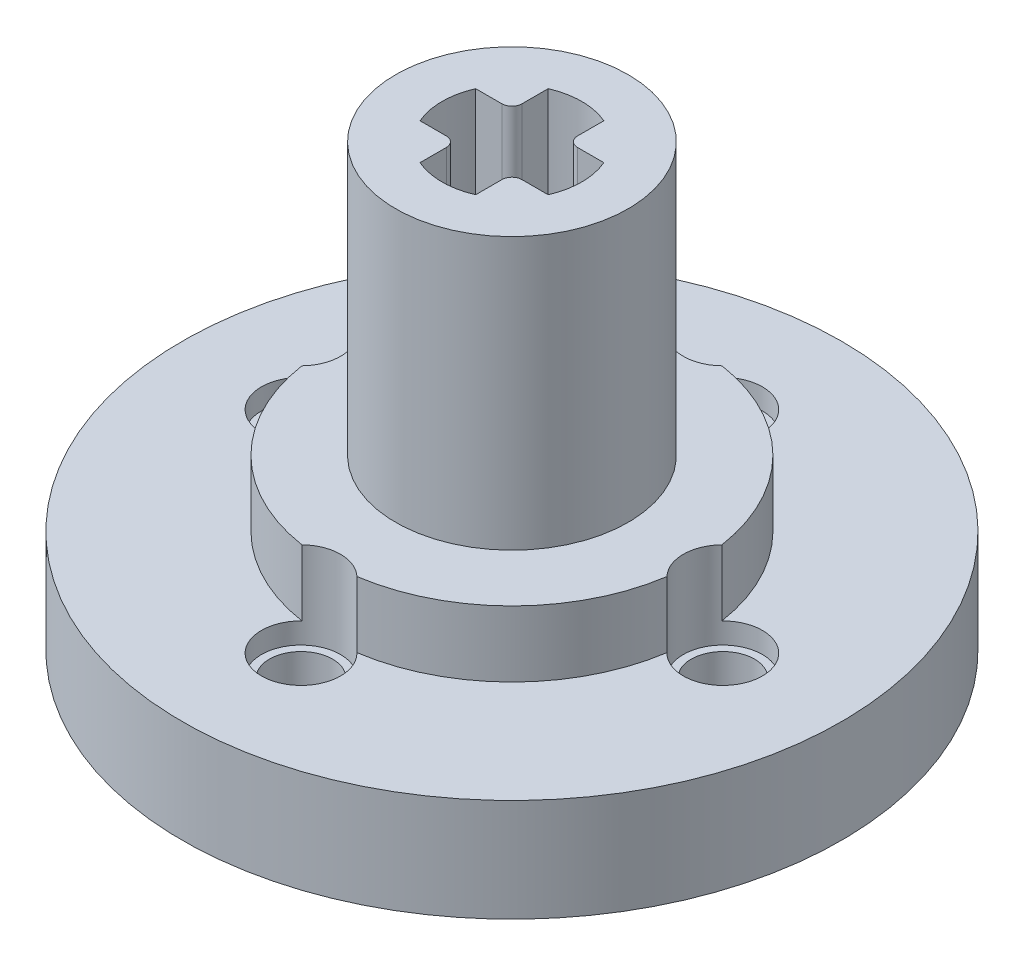
ISO-10303-21;
HEADER;
FILE_DESCRIPTION(('STEP AP214'),'2;1');
FILE_NAME('part.step','',(''),(''),'','','');
FILE_SCHEMA(('AUTOMOTIVE_DESIGN { 1 0 10303 214 1 1 1 1 }'));
ENDSEC;
DATA;
#1=APPLICATION_CONTEXT('core data for automotive mechanical design processes');
#2=APPLICATION_PROTOCOL_DEFINITION('international standard','automotive_design',2000,#1);
#3=PRODUCT_CONTEXT('',#1,'mechanical');
#4=PRODUCT('Part','Part','',(#3));
#5=PRODUCT_RELATED_PRODUCT_CATEGORY('part','',(#4));
#6=PRODUCT_DEFINITION_FORMATION('','',#4);
#7=PRODUCT_DEFINITION_CONTEXT('part definition',#1,'design');
#8=PRODUCT_DEFINITION('design','',#6,#7);
#9=PRODUCT_DEFINITION_SHAPE('','',#8);
#10=(LENGTH_UNIT() NAMED_UNIT(*) SI_UNIT(.MILLI.,.METRE.));
#11=(NAMED_UNIT(*) PLANE_ANGLE_UNIT() SI_UNIT($,.RADIAN.));
#12=(NAMED_UNIT(*) SI_UNIT($,.STERADIAN.) SOLID_ANGLE_UNIT());
#13=UNCERTAINTY_MEASURE_WITH_UNIT(LENGTH_MEASURE(1.E-05),#10,'distance_accuracy_value','');
#14=(GEOMETRIC_REPRESENTATION_CONTEXT(3) GLOBAL_UNCERTAINTY_ASSIGNED_CONTEXT((#13)) GLOBAL_UNIT_ASSIGNED_CONTEXT((#10,
#11,#12)) REPRESENTATION_CONTEXT('',''));
#15=CARTESIAN_POINT('',(0.,0.,0.));
#16=DIRECTION('',(0.,0.,1.));
#17=DIRECTION('',(1.,0.,0.));
#18=AXIS2_PLACEMENT_3D('',#15,#16,#17);
#19=CARTESIAN_POINT('',(0.,0.,0.));
#20=DIRECTION('',(0.,-1.,0.));
#21=DIRECTION('',(0.,0.,-1.));
#22=AXIS2_PLACEMENT_3D('',#19,#20,#21);
#23=CYLINDRICAL_SURFACE('',#22,7.);
#24=CARTESIAN_POINT('',(0.,3.9,0.));
#25=DIRECTION('',(0.,-1.,0.));
#26=DIRECTION('',(0.,0.,-1.));
#27=AXIS2_PLACEMENT_3D('',#24,#25,#26);
#28=CIRCLE('',#27,7.);
#29=CARTESIAN_POINT('',(1.04290291224783,3.9,-6.921875));
#30=VERTEX_POINT('',#29);
#31=CARTESIAN_POINT('',(6.921875,3.9,-1.04290291224782));
#32=VERTEX_POINT('',#31);
#33=EDGE_CURVE('E240',#30,#32,#28,.T.);
#34=ORIENTED_EDGE('',*,*,#33,.F.);
#35=DIRECTION('',(0.,-1.,0.));
#36=VECTOR('',#35,1.);
#37=CARTESIAN_POINT('',(1.04290291224783,4.753125,-6.921875));
#38=LINE('',#37,#36);
#39=CARTESIAN_POINT('',(1.04290291224783,6.4,-6.921875));
#40=VERTEX_POINT('',#39);
#41=EDGE_CURVE('E324',#30,#40,#38,.F.);
#42=ORIENTED_EDGE('',*,*,#41,.T.);
#43=CARTESIAN_POINT('',(0.,6.4,0.));
#44=DIRECTION('',(0.,-1.,0.));
#45=DIRECTION('',(0.,0.,-1.));
#46=AXIS2_PLACEMENT_3D('',#43,#44,#45);
#47=CIRCLE('',#46,7.);
#48=CARTESIAN_POINT('',(6.921875,6.4,-1.04290291224782));
#49=VERTEX_POINT('',#48);
#50=EDGE_CURVE('E230',#40,#49,#47,.T.);
#51=ORIENTED_EDGE('',*,*,#50,.T.);
#52=DIRECTION('',(0.,-1.,0.));
#53=VECTOR('',#52,1.);
#54=CARTESIAN_POINT('',(6.921875,4.753125,-1.04290291224782));
#55=LINE('',#54,#53);
#56=EDGE_CURVE('E207',#49,#32,#55,.T.);
#57=ORIENTED_EDGE('',*,*,#56,.T.);
#58=EDGE_LOOP('',(#34,#42,#51,#57));
#59=FACE_BOUND('',#58,.T.);
#60=ADVANCED_FACE('F41',(#59),#23,.T.);
#61=CARTESIAN_POINT('',(-6.921875,6.4,-1.04290291224782));
#62=VERTEX_POINT('',#61);
#63=CARTESIAN_POINT('',(-1.04290291224783,6.4,-6.921875));
#64=VERTEX_POINT('',#63);
#65=EDGE_CURVE('E234',#62,#64,#47,.T.);
#66=ORIENTED_EDGE('',*,*,#65,.T.);
#67=DIRECTION('',(0.,-1.,0.));
#68=VECTOR('',#67,1.);
#69=CARTESIAN_POINT('',(-1.04290291224783,4.753125,-6.921875));
#70=LINE('',#69,#68);
#71=CARTESIAN_POINT('',(-1.04290291224783,3.9,-6.921875));
#72=VERTEX_POINT('',#71);
#73=EDGE_CURVE('E56',#64,#72,#70,.T.);
#74=ORIENTED_EDGE('',*,*,#73,.T.);
#75=CARTESIAN_POINT('',(-6.921875,3.9,-1.04290291224782));
#76=VERTEX_POINT('',#75);
#77=EDGE_CURVE('E233',#76,#72,#28,.T.);
#78=ORIENTED_EDGE('',*,*,#77,.F.);
#79=DIRECTION('',(0.,-1.,0.));
#80=VECTOR('',#79,1.);
#81=CARTESIAN_POINT('',(-6.921875,4.753125,-1.04290291224782));
#82=LINE('',#81,#80);
#83=EDGE_CURVE('E318',#76,#62,#82,.F.);
#84=ORIENTED_EDGE('',*,*,#83,.T.);
#85=EDGE_LOOP('',(#66,#74,#78,#84));
#86=FACE_BOUND('',#85,.T.);
#87=ADVANCED_FACE('F265',(#86),#23,.T.);
#88=CARTESIAN_POINT('',(-1.04290291224783,6.4,6.921875));
#89=VERTEX_POINT('',#88);
#90=CARTESIAN_POINT('',(-6.921875,6.4,1.04290291224782));
#91=VERTEX_POINT('',#90);
#92=EDGE_CURVE('E231',#89,#91,#47,.T.);
#93=ORIENTED_EDGE('',*,*,#92,.T.);
#94=DIRECTION('',(0.,-1.,0.));
#95=VECTOR('',#94,1.);
#96=CARTESIAN_POINT('',(-6.921875,4.753125,1.04290291224783));
#97=LINE('',#96,#95);
#98=CARTESIAN_POINT('',(-6.921875,3.9,1.04290291224783));
#99=VERTEX_POINT('',#98);
#100=EDGE_CURVE('E63',#91,#99,#97,.T.);
#101=ORIENTED_EDGE('',*,*,#100,.T.);
#102=CARTESIAN_POINT('',(-1.04290291224783,3.9,6.921875));
#103=VERTEX_POINT('',#102);
#104=EDGE_CURVE('E461',#103,#99,#28,.T.);
#105=ORIENTED_EDGE('',*,*,#104,.F.);
#106=DIRECTION('',(0.,-1.,0.));
#107=VECTOR('',#106,1.);
#108=CARTESIAN_POINT('',(-1.04290291224783,4.753125,6.921875));
#109=LINE('',#108,#107);
#110=EDGE_CURVE('E288',#103,#89,#109,.F.);
#111=ORIENTED_EDGE('',*,*,#110,.T.);
#112=EDGE_LOOP('',(#93,#101,#105,#111));
#113=FACE_BOUND('',#112,.T.);
#114=ADVANCED_FACE('F272',(#113),#23,.T.);
#115=CARTESIAN_POINT('',(6.921875,6.4,1.04290291224783));
#116=VERTEX_POINT('',#115);
#117=CARTESIAN_POINT('',(1.04290291224783,6.4,6.921875));
#118=VERTEX_POINT('',#117);
#119=EDGE_CURVE('E220',#116,#118,#47,.T.);
#120=ORIENTED_EDGE('',*,*,#119,.T.);
#121=DIRECTION('',(0.,-1.,0.));
#122=VECTOR('',#121,1.);
#123=CARTESIAN_POINT('',(1.04290291224783,4.753125,6.921875));
#124=LINE('',#123,#122);
#125=CARTESIAN_POINT('',(1.04290291224783,3.9,6.921875));
#126=VERTEX_POINT('',#125);
#127=EDGE_CURVE('E223',#118,#126,#124,.T.);
#128=ORIENTED_EDGE('',*,*,#127,.T.);
#129=CARTESIAN_POINT('',(6.921875,3.9,1.04290291224782));
#130=VERTEX_POINT('',#129);
#131=EDGE_CURVE('E222',#130,#126,#28,.T.);
#132=ORIENTED_EDGE('',*,*,#131,.F.);
#133=DIRECTION('',(0.,-1.,0.));
#134=VECTOR('',#133,1.);
#135=CARTESIAN_POINT('',(6.921875,4.753125,1.04290291224783));
#136=LINE('',#135,#134);
#137=EDGE_CURVE('E204',#130,#116,#136,.F.);
#138=ORIENTED_EDGE('',*,*,#137,.T.);
#139=EDGE_LOOP('',(#120,#128,#132,#138));
#140=FACE_BOUND('',#139,.T.);
#141=ADVANCED_FACE('F218',(#140),#23,.T.);
#142=CARTESIAN_POINT('',(0.,0.,0.));
#143=DIRECTION('',(0.,-1.,0.));
#144=DIRECTION('',(0.,0.,-1.));
#145=AXIS2_PLACEMENT_3D('',#142,#143,#144);
#146=PLANE('',#145);
#147=CARTESIAN_POINT('',(8.,0.,0.));
#148=DIRECTION('',(0.,-1.,0.));
#149=DIRECTION('',(0.,0.,-1.));
#150=AXIS2_PLACEMENT_3D('',#147,#148,#149);
#151=CIRCLE('',#150,1.2);
#152=CARTESIAN_POINT('',(8.,0.,-1.2));
#153=VERTEX_POINT('',#152);
#154=EDGE_CURVE('E661',#153,#153,#151,.F.);
#155=ORIENTED_EDGE('',*,*,#154,.T.);
#156=EDGE_LOOP('',(#155));
#157=FACE_BOUND('',#156,.T.);
#158=CARTESIAN_POINT('',(0.,0.,-8.));
#159=DIRECTION('',(0.,-1.,0.));
#160=DIRECTION('',(0.,0.,-1.));
#161=AXIS2_PLACEMENT_3D('',#158,#159,#160);
#162=CIRCLE('',#161,1.2);
#163=CARTESIAN_POINT('',(0.,0.,-9.2));
#164=VERTEX_POINT('',#163);
#165=EDGE_CURVE('E668',#164,#164,#162,.F.);
#166=ORIENTED_EDGE('',*,*,#165,.T.);
#167=EDGE_LOOP('',(#166));
#168=FACE_BOUND('',#167,.T.);
#169=CARTESIAN_POINT('',(-8.,0.,0.));
#170=DIRECTION('',(0.,-1.,0.));
#171=DIRECTION('',(0.,0.,-1.));
#172=AXIS2_PLACEMENT_3D('',#169,#170,#171);
#173=CIRCLE('',#172,1.2);
#174=CARTESIAN_POINT('',(-8.,0.,-1.2));
#175=VERTEX_POINT('',#174);
#176=EDGE_CURVE('E673',#175,#175,#173,.F.);
#177=ORIENTED_EDGE('',*,*,#176,.T.);
#178=EDGE_LOOP('',(#177));
#179=FACE_BOUND('',#178,.T.);
#180=CARTESIAN_POINT('',(0.,0.,8.));
#181=DIRECTION('',(0.,-1.,0.));
#182=DIRECTION('',(0.,0.,-1.));
#183=AXIS2_PLACEMENT_3D('',#180,#181,#182);
#184=CIRCLE('',#183,1.2);
#185=CARTESIAN_POINT('',(0.,0.,6.8));
#186=VERTEX_POINT('',#185);
#187=EDGE_CURVE('E676',#186,#186,#184,.F.);
#188=ORIENTED_EDGE('',*,*,#187,.T.);
#189=EDGE_LOOP('',(#188));
#190=FACE_BOUND('',#189,.T.);
#191=CARTESIAN_POINT('',(0.,0.,0.));
#192=DIRECTION('',(0.,-1.,0.));
#193=DIRECTION('',(0.,0.,-1.));
#194=AXIS2_PLACEMENT_3D('',#191,#192,#193);
#195=CIRCLE('',#194,12.5);
#196=CARTESIAN_POINT('',(0.,0.,-12.5));
#197=VERTEX_POINT('',#196);
#198=EDGE_CURVE('E49',#197,#197,#195,.T.);
#199=ORIENTED_EDGE('',*,*,#198,.T.);
#200=EDGE_LOOP('',(#199));
#201=FACE_BOUND('',#200,.T.);
#202=DIRECTION('',(1.,0.,0.));
#203=VECTOR('',#202,1.);
#204=CARTESIAN_POINT('',(0.,0.,1.055));
#205=LINE('',#204,#203);
#206=CARTESIAN_POINT('',(-2.43004155190476,0.,1.055));
#207=VERTEX_POINT('',#206);
#208=CARTESIAN_POINT('',(-1.435,0.,1.055));
#209=VERTEX_POINT('',#208);
#210=EDGE_CURVE('E364',#207,#209,#205,.T.);
#211=ORIENTED_EDGE('',*,*,#210,.T.);
#212=CARTESIAN_POINT('',(-1.435,0.,1.435));
#213=DIRECTION('',(0.,-1.,0.));
#214=DIRECTION('',(0.,0.,-1.));
#215=AXIS2_PLACEMENT_3D('',#212,#213,#214);
#216=CIRCLE('',#215,0.38);
#217=CARTESIAN_POINT('',(-1.055,0.,1.435));
#218=VERTEX_POINT('',#217);
#219=EDGE_CURVE('E417',#209,#218,#216,.T.);
#220=ORIENTED_EDGE('',*,*,#219,.T.);
#221=DIRECTION('',(0.,0.,1.));
#222=VECTOR('',#221,1.);
#223=CARTESIAN_POINT('',(-1.055,0.,0.));
#224=LINE('',#223,#222);
#225=CARTESIAN_POINT('',(-1.055,0.,2.43004155190476));
#226=VERTEX_POINT('',#225);
#227=EDGE_CURVE('E327',#218,#226,#224,.T.);
#228=ORIENTED_EDGE('',*,*,#227,.T.);
#229=CARTESIAN_POINT('',(0.,0.,0.));
#230=DIRECTION('',(0.,-1.,0.));
#231=DIRECTION('',(0.,0.,-1.));
#232=AXIS2_PLACEMENT_3D('',#229,#230,#231);
#233=CIRCLE('',#232,2.64917476659878);
#234=CARTESIAN_POINT('',(1.055,0.,2.43004155190476));
#235=VERTEX_POINT('',#234);
#236=EDGE_CURVE('E330',#226,#235,#233,.F.);
#237=ORIENTED_EDGE('',*,*,#236,.T.);
#238=DIRECTION('',(0.,0.,1.));
#239=VECTOR('',#238,1.);
#240=CARTESIAN_POINT('',(1.055,0.,0.));
#241=LINE('',#240,#239);
#242=CARTESIAN_POINT('',(1.055,0.,1.435));
#243=VERTEX_POINT('',#242);
#244=EDGE_CURVE('E333',#243,#235,#241,.T.);
#245=ORIENTED_EDGE('',*,*,#244,.F.);
#246=CARTESIAN_POINT('',(1.435,0.,1.435));
#247=DIRECTION('',(0.,-1.,0.));
#248=DIRECTION('',(0.,0.,-1.));
#249=AXIS2_PLACEMENT_3D('',#246,#247,#248);
#250=CIRCLE('',#249,0.38);
#251=CARTESIAN_POINT('',(1.435,0.,1.055));
#252=VERTEX_POINT('',#251);
#253=EDGE_CURVE('E335',#243,#252,#250,.T.);
#254=ORIENTED_EDGE('',*,*,#253,.T.);
#255=DIRECTION('',(1.,0.,0.));
#256=VECTOR('',#255,1.);
#257=CARTESIAN_POINT('',(0.,0.,1.055));
#258=LINE('',#257,#256);
#259=CARTESIAN_POINT('',(2.43004155190476,0.,1.055));
#260=VERTEX_POINT('',#259);
#261=EDGE_CURVE('E338',#252,#260,#258,.T.);
#262=ORIENTED_EDGE('',*,*,#261,.T.);
#263=CARTESIAN_POINT('',(0.,0.,0.));
#264=DIRECTION('',(0.,-1.,0.));
#265=DIRECTION('',(0.,0.,-1.));
#266=AXIS2_PLACEMENT_3D('',#263,#264,#265);
#267=CIRCLE('',#266,2.64917476659878);
#268=CARTESIAN_POINT('',(2.43004155190476,0.,-1.055));
#269=VERTEX_POINT('',#268);
#270=EDGE_CURVE('E341',#260,#269,#267,.F.);
#271=ORIENTED_EDGE('',*,*,#270,.T.);
#272=DIRECTION('',(1.,0.,0.));
#273=VECTOR('',#272,1.);
#274=CARTESIAN_POINT('',(0.,0.,-1.055));
#275=LINE('',#274,#273);
#276=CARTESIAN_POINT('',(1.435,0.,-1.055));
#277=VERTEX_POINT('',#276);
#278=EDGE_CURVE('E344',#277,#269,#275,.T.);
#279=ORIENTED_EDGE('',*,*,#278,.F.);
#280=CARTESIAN_POINT('',(1.435,0.,-1.435));
#281=DIRECTION('',(0.,-1.,0.));
#282=DIRECTION('',(0.,0.,-1.));
#283=AXIS2_PLACEMENT_3D('',#280,#281,#282);
#284=CIRCLE('',#283,0.38);
#285=CARTESIAN_POINT('',(1.055,0.,-1.435));
#286=VERTEX_POINT('',#285);
#287=EDGE_CURVE('E346',#286,#277,#284,.F.);
#288=ORIENTED_EDGE('',*,*,#287,.F.);
#289=DIRECTION('',(0.,0.,1.));
#290=VECTOR('',#289,1.);
#291=CARTESIAN_POINT('',(1.055,0.,0.));
#292=LINE('',#291,#290);
#293=CARTESIAN_POINT('',(1.055,0.,-2.43004155190476));
#294=VERTEX_POINT('',#293);
#295=EDGE_CURVE('E348',#294,#286,#292,.T.);
#296=ORIENTED_EDGE('',*,*,#295,.F.);
#297=CARTESIAN_POINT('',(0.,0.,0.));
#298=DIRECTION('',(0.,-1.,0.));
#299=DIRECTION('',(0.,0.,-1.));
#300=AXIS2_PLACEMENT_3D('',#297,#298,#299);
#301=CIRCLE('',#300,2.64917476659878);
#302=CARTESIAN_POINT('',(-1.055,0.,-2.43004155190476));
#303=VERTEX_POINT('',#302);
#304=EDGE_CURVE('E350',#294,#303,#301,.F.);
#305=ORIENTED_EDGE('',*,*,#304,.T.);
#306=DIRECTION('',(0.,0.,1.));
#307=VECTOR('',#306,1.);
#308=CARTESIAN_POINT('',(-1.055,0.,0.));
#309=LINE('',#308,#307);
#310=CARTESIAN_POINT('',(-1.055,0.,-1.435));
#311=VERTEX_POINT('',#310);
#312=EDGE_CURVE('E353',#303,#311,#309,.T.);
#313=ORIENTED_EDGE('',*,*,#312,.T.);
#314=CARTESIAN_POINT('',(-1.435,0.,-1.435));
#315=DIRECTION('',(0.,-1.,0.));
#316=DIRECTION('',(0.,0.,-1.));
#317=AXIS2_PLACEMENT_3D('',#314,#315,#316);
#318=CIRCLE('',#317,0.38);
#319=CARTESIAN_POINT('',(-1.435,0.,-1.055));
#320=VERTEX_POINT('',#319);
#321=EDGE_CURVE('E356',#311,#320,#318,.T.);
#322=ORIENTED_EDGE('',*,*,#321,.T.);
#323=DIRECTION('',(1.,0.,0.));
#324=VECTOR('',#323,1.);
#325=CARTESIAN_POINT('',(0.,0.,-1.055));
#326=LINE('',#325,#324);
#327=CARTESIAN_POINT('',(-2.43004155190476,0.,-1.055));
#328=VERTEX_POINT('',#327);
#329=EDGE_CURVE('E359',#328,#320,#326,.T.);
#330=ORIENTED_EDGE('',*,*,#329,.F.);
#331=CARTESIAN_POINT('',(0.,0.,0.));
#332=DIRECTION('',(0.,-1.,0.));
#333=DIRECTION('',(0.,0.,-1.));
#334=AXIS2_PLACEMENT_3D('',#331,#332,#333);
#335=CIRCLE('',#334,2.64917476659878);
#336=EDGE_CURVE('E361',#328,#207,#335,.F.);
#337=ORIENTED_EDGE('',*,*,#336,.T.);
#338=EDGE_LOOP('',(#211,#220,#228,#237,#245,#254,#262,#271,#279,#288,#296,#305,#313,#322,#330,#337));
#339=FACE_BOUND('',#338,.T.);
#340=ADVANCED_FACE('F43',(#157,#168,#179,#190,#201,#339),#146,.T.);
#341=CARTESIAN_POINT('',(4.41,16.7,0.));
#342=DIRECTION('',(0.,1.,0.));
#343=DIRECTION('',(0.,0.,1.));
#344=AXIS2_PLACEMENT_3D('',#341,#342,#343);
#345=PLANE('',#344);
#346=CARTESIAN_POINT('',(0.,16.7,0.));
#347=DIRECTION('',(0.,-1.,0.));
#348=DIRECTION('',(0.,0.,-1.));
#349=AXIS2_PLACEMENT_3D('',#346,#347,#348);
#350=CIRCLE('',#349,4.41);
#351=CARTESIAN_POINT('',(0.,16.7,-4.41));
#352=VERTEX_POINT('',#351);
#353=EDGE_CURVE('E449',#352,#352,#350,.T.);
#354=ORIENTED_EDGE('',*,*,#353,.F.);
#355=EDGE_LOOP('',(#354));
#356=FACE_BOUND('',#355,.T.);
#357=DIRECTION('',(1.,0.,0.));
#358=VECTOR('',#357,1.);
#359=CARTESIAN_POINT('',(0.,16.7,1.055));
#360=LINE('',#359,#358);
#361=CARTESIAN_POINT('',(-2.43004155190476,16.7,1.055));
#362=VERTEX_POINT('',#361);
#363=CARTESIAN_POINT('',(-1.435,16.7,1.055));
#364=VERTEX_POINT('',#363);
#365=EDGE_CURVE('E367',#362,#364,#360,.T.);
#366=ORIENTED_EDGE('',*,*,#365,.F.);
#367=CARTESIAN_POINT('',(0.,16.7,0.));
#368=DIRECTION('',(0.,1.,0.));
#369=DIRECTION('',(0.,0.,1.));
#370=AXIS2_PLACEMENT_3D('',#367,#368,#369);
#371=CIRCLE('',#370,2.64917476659878);
#372=CARTESIAN_POINT('',(-2.43004155190476,16.7,-1.055));
#373=VERTEX_POINT('',#372);
#374=EDGE_CURVE('E411',#373,#362,#371,.T.);
#375=ORIENTED_EDGE('',*,*,#374,.F.);
#376=DIRECTION('',(1.,0.,0.));
#377=VECTOR('',#376,1.);
#378=CARTESIAN_POINT('',(0.,16.7,-1.055));
#379=LINE('',#378,#377);
#380=CARTESIAN_POINT('',(-1.435,16.7,-1.055));
#381=VERTEX_POINT('',#380);
#382=EDGE_CURVE('E408',#373,#381,#379,.T.);
#383=ORIENTED_EDGE('',*,*,#382,.T.);
#384=CARTESIAN_POINT('',(-1.435,16.7,-1.435));
#385=DIRECTION('',(0.,1.,0.));
#386=DIRECTION('',(0.,0.,1.));
#387=AXIS2_PLACEMENT_3D('',#384,#385,#386);
#388=CIRCLE('',#387,0.38);
#389=CARTESIAN_POINT('',(-1.055,16.7,-1.435));
#390=VERTEX_POINT('',#389);
#391=EDGE_CURVE('E405',#390,#381,#388,.F.);
#392=ORIENTED_EDGE('',*,*,#391,.F.);
#393=DIRECTION('',(0.,0.,1.));
#394=VECTOR('',#393,1.);
#395=CARTESIAN_POINT('',(-1.055,16.7,0.));
#396=LINE('',#395,#394);
#397=CARTESIAN_POINT('',(-1.055,16.7,-2.43004155190476));
#398=VERTEX_POINT('',#397);
#399=EDGE_CURVE('E402',#398,#390,#396,.T.);
#400=ORIENTED_EDGE('',*,*,#399,.F.);
#401=CARTESIAN_POINT('',(0.,16.7,0.));
#402=DIRECTION('',(0.,1.,0.));
#403=DIRECTION('',(0.,0.,1.));
#404=AXIS2_PLACEMENT_3D('',#401,#402,#403);
#405=CIRCLE('',#404,2.64917476659878);
#406=CARTESIAN_POINT('',(1.055,16.7,-2.43004155190476));
#407=VERTEX_POINT('',#406);
#408=EDGE_CURVE('E399',#407,#398,#405,.T.);
#409=ORIENTED_EDGE('',*,*,#408,.F.);
#410=DIRECTION('',(0.,0.,1.));
#411=VECTOR('',#410,1.);
#412=CARTESIAN_POINT('',(1.055,16.7,0.));
#413=LINE('',#412,#411);
#414=CARTESIAN_POINT('',(1.055,16.7,-1.435));
#415=VERTEX_POINT('',#414);
#416=EDGE_CURVE('E396',#407,#415,#413,.T.);
#417=ORIENTED_EDGE('',*,*,#416,.T.);
#418=CARTESIAN_POINT('',(1.435,16.7,-1.435));
#419=DIRECTION('',(0.,1.,0.));
#420=DIRECTION('',(0.,0.,1.));
#421=AXIS2_PLACEMENT_3D('',#418,#419,#420);
#422=CIRCLE('',#421,0.38);
#423=CARTESIAN_POINT('',(1.435,16.7,-1.055));
#424=VERTEX_POINT('',#423);
#425=EDGE_CURVE('E393',#415,#424,#422,.T.);
#426=ORIENTED_EDGE('',*,*,#425,.T.);
#427=DIRECTION('',(1.,0.,0.));
#428=VECTOR('',#427,1.);
#429=CARTESIAN_POINT('',(0.,16.7,-1.055));
#430=LINE('',#429,#428);
#431=CARTESIAN_POINT('',(2.43004155190476,16.7,-1.055));
#432=VERTEX_POINT('',#431);
#433=EDGE_CURVE('E390',#424,#432,#430,.T.);
#434=ORIENTED_EDGE('',*,*,#433,.T.);
#435=CARTESIAN_POINT('',(0.,16.7,0.));
#436=DIRECTION('',(0.,1.,0.));
#437=DIRECTION('',(0.,0.,1.));
#438=AXIS2_PLACEMENT_3D('',#435,#436,#437);
#439=CIRCLE('',#438,2.64917476659878);
#440=CARTESIAN_POINT('',(2.43004155190476,16.7,1.055));
#441=VERTEX_POINT('',#440);
#442=EDGE_CURVE('E387',#441,#432,#439,.T.);
#443=ORIENTED_EDGE('',*,*,#442,.F.);
#444=DIRECTION('',(1.,0.,0.));
#445=VECTOR('',#444,1.);
#446=CARTESIAN_POINT('',(0.,16.7,1.055));
#447=LINE('',#446,#445);
#448=CARTESIAN_POINT('',(1.435,16.7,1.055));
#449=VERTEX_POINT('',#448);
#450=EDGE_CURVE('E384',#449,#441,#447,.T.);
#451=ORIENTED_EDGE('',*,*,#450,.F.);
#452=CARTESIAN_POINT('',(1.435,16.7,1.435));
#453=DIRECTION('',(0.,1.,0.));
#454=DIRECTION('',(0.,0.,1.));
#455=AXIS2_PLACEMENT_3D('',#452,#453,#454);
#456=CIRCLE('',#455,0.38);
#457=CARTESIAN_POINT('',(1.055,16.7,1.435));
#458=VERTEX_POINT('',#457);
#459=EDGE_CURVE('E381',#458,#449,#456,.F.);
#460=ORIENTED_EDGE('',*,*,#459,.F.);
#461=DIRECTION('',(0.,0.,1.));
#462=VECTOR('',#461,1.);
#463=CARTESIAN_POINT('',(1.055,16.7,0.));
#464=LINE('',#463,#462);
#465=CARTESIAN_POINT('',(1.055,16.7,2.43004155190476));
#466=VERTEX_POINT('',#465);
#467=EDGE_CURVE('E378',#458,#466,#464,.T.);
#468=ORIENTED_EDGE('',*,*,#467,.T.);
#469=CARTESIAN_POINT('',(0.,16.7,0.));
#470=DIRECTION('',(0.,1.,0.));
#471=DIRECTION('',(0.,0.,1.));
#472=AXIS2_PLACEMENT_3D('',#469,#470,#471);
#473=CIRCLE('',#472,2.64917476659878);
#474=CARTESIAN_POINT('',(-1.055,16.7,2.43004155190476));
#475=VERTEX_POINT('',#474);
#476=EDGE_CURVE('E375',#475,#466,#473,.T.);
#477=ORIENTED_EDGE('',*,*,#476,.F.);
#478=DIRECTION('',(0.,0.,1.));
#479=VECTOR('',#478,1.);
#480=CARTESIAN_POINT('',(-1.055,16.7,0.));
#481=LINE('',#480,#479);
#482=CARTESIAN_POINT('',(-1.055,16.7,1.435));
#483=VERTEX_POINT('',#482);
#484=EDGE_CURVE('E372',#483,#475,#481,.T.);
#485=ORIENTED_EDGE('',*,*,#484,.F.);
#486=CARTESIAN_POINT('',(-1.435,16.7,1.435));
#487=DIRECTION('',(0.,1.,0.));
#488=DIRECTION('',(0.,0.,1.));
#489=AXIS2_PLACEMENT_3D('',#486,#487,#488);
#490=CIRCLE('',#489,0.38);
#491=EDGE_CURVE('E369',#364,#483,#490,.F.);
#492=ORIENTED_EDGE('',*,*,#491,.F.);
#493=EDGE_LOOP('',(#366,#375,#383,#392,#400,#409,#417,#426,#434,#443,#451,#460,#468,#477,#485,#492));
#494=FACE_BOUND('',#493,.T.);
#495=ADVANCED_FACE('F253',(#356,#494),#345,.T.);
#496=CARTESIAN_POINT('',(0.,0.,0.));
#497=DIRECTION('',(0.,-1.,0.));
#498=DIRECTION('',(0.,0.,-1.));
#499=AXIS2_PLACEMENT_3D('',#496,#497,#498);
#500=CYLINDRICAL_SURFACE('',#499,12.5);
#501=CARTESIAN_POINT('',(0.,3.9,0.));
#502=DIRECTION('',(0.,-1.,0.));
#503=DIRECTION('',(0.,0.,-1.));
#504=AXIS2_PLACEMENT_3D('',#501,#502,#503);
#505=CIRCLE('',#504,12.5);
#506=CARTESIAN_POINT('',(0.,3.9,-12.5));
#507=VERTEX_POINT('',#506);
#508=EDGE_CURVE('E243',#507,#507,#505,.T.);
#509=ORIENTED_EDGE('',*,*,#508,.T.);
#510=EDGE_LOOP('',(#509));
#511=FACE_BOUND('',#510,.T.);
#512=ORIENTED_EDGE('',*,*,#198,.F.);
#513=EDGE_LOOP('',(#512));
#514=FACE_BOUND('',#513,.T.);
#515=ADVANCED_FACE('F250',(#511,#514),#500,.T.);
#516=CARTESIAN_POINT('',(12.5,3.9,0.));
#517=DIRECTION('',(0.,1.,0.));
#518=DIRECTION('',(0.,0.,1.));
#519=AXIS2_PLACEMENT_3D('',#516,#517,#518);
#520=PLANE('',#519);
#521=ORIENTED_EDGE('',*,*,#77,.T.);
#522=CARTESIAN_POINT('',(0.,3.9,-8.));
#523=DIRECTION('',(0.,1.,0.));
#524=DIRECTION('',(0.,0.,1.));
#525=AXIS2_PLACEMENT_3D('',#522,#523,#524);
#526=CIRCLE('',#525,1.5);
#527=EDGE_CURVE('E321',#72,#30,#526,.F.);
#528=ORIENTED_EDGE('',*,*,#527,.T.);
#529=ORIENTED_EDGE('',*,*,#33,.T.);
#530=CARTESIAN_POINT('',(8.,3.9,0.));
#531=DIRECTION('',(0.,1.,0.));
#532=DIRECTION('',(0.,0.,1.));
#533=AXIS2_PLACEMENT_3D('',#530,#531,#532);
#534=CIRCLE('',#533,1.5);
#535=EDGE_CURVE('E224',#32,#130,#534,.F.);
#536=ORIENTED_EDGE('',*,*,#535,.T.);
#537=ORIENTED_EDGE('',*,*,#131,.T.);
#538=CARTESIAN_POINT('',(0.,3.9,8.));
#539=DIRECTION('',(0.,1.,0.));
#540=DIRECTION('',(0.,0.,1.));
#541=AXIS2_PLACEMENT_3D('',#538,#539,#540);
#542=CIRCLE('',#541,1.5);
#543=EDGE_CURVE('E310',#126,#103,#542,.F.);
#544=ORIENTED_EDGE('',*,*,#543,.T.);
#545=ORIENTED_EDGE('',*,*,#104,.T.);
#546=CARTESIAN_POINT('',(-8.,3.9,0.));
#547=DIRECTION('',(0.,1.,0.));
#548=DIRECTION('',(0.,0.,1.));
#549=AXIS2_PLACEMENT_3D('',#546,#547,#548);
#550=CIRCLE('',#549,1.5);
#551=EDGE_CURVE('E315',#99,#76,#550,.F.);
#552=ORIENTED_EDGE('',*,*,#551,.T.);
#553=EDGE_LOOP('',(#521,#528,#529,#536,#537,#544,#545,#552));
#554=FACE_BOUND('',#553,.T.);
#555=ORIENTED_EDGE('',*,*,#508,.F.);
#556=EDGE_LOOP('',(#555));
#557=FACE_BOUND('',#556,.T.);
#558=ADVANCED_FACE('F252',(#554,#557),#520,.T.);
#559=CARTESIAN_POINT('',(7.,6.4,0.));
#560=DIRECTION('',(0.,1.,0.));
#561=DIRECTION('',(0.,0.,1.));
#562=AXIS2_PLACEMENT_3D('',#559,#560,#561);
#563=PLANE('',#562);
#564=CARTESIAN_POINT('',(0.,6.4,0.));
#565=DIRECTION('',(0.,-1.,0.));
#566=DIRECTION('',(0.,0.,-1.));
#567=AXIS2_PLACEMENT_3D('',#564,#565,#566);
#568=CIRCLE('',#567,4.41);
#569=CARTESIAN_POINT('',(0.,6.4,-4.41));
#570=VERTEX_POINT('',#569);
#571=EDGE_CURVE('E238',#570,#570,#568,.T.);
#572=ORIENTED_EDGE('',*,*,#571,.T.);
#573=EDGE_LOOP('',(#572));
#574=FACE_BOUND('',#573,.T.);
#575=ORIENTED_EDGE('',*,*,#50,.F.);
#576=CARTESIAN_POINT('',(0.,6.4,-8.));
#577=DIRECTION('',(0.,1.,0.));
#578=DIRECTION('',(0.,0.,1.));
#579=AXIS2_PLACEMENT_3D('',#576,#577,#578);
#580=CIRCLE('',#579,1.5);
#581=EDGE_CURVE('E11',#40,#64,#580,.F.);
#582=ORIENTED_EDGE('',*,*,#581,.T.);
#583=ORIENTED_EDGE('',*,*,#65,.F.);
#584=CARTESIAN_POINT('',(-8.,6.4,0.));
#585=DIRECTION('',(0.,1.,0.));
#586=DIRECTION('',(0.,0.,1.));
#587=AXIS2_PLACEMENT_3D('',#584,#585,#586);
#588=CIRCLE('',#587,1.5);
#589=EDGE_CURVE('E290',#91,#62,#588,.T.);
#590=ORIENTED_EDGE('',*,*,#589,.F.);
#591=ORIENTED_EDGE('',*,*,#92,.F.);
#592=CARTESIAN_POINT('',(0.,6.4,8.));
#593=DIRECTION('',(0.,1.,0.));
#594=DIRECTION('',(0.,0.,1.));
#595=AXIS2_PLACEMENT_3D('',#592,#593,#594);
#596=CIRCLE('',#595,1.5);
#597=EDGE_CURVE('E229',#118,#89,#596,.T.);
#598=ORIENTED_EDGE('',*,*,#597,.F.);
#599=ORIENTED_EDGE('',*,*,#119,.F.);
#600=CARTESIAN_POINT('',(8.,6.4,0.));
#601=DIRECTION('',(0.,1.,0.));
#602=DIRECTION('',(0.,0.,1.));
#603=AXIS2_PLACEMENT_3D('',#600,#601,#602);
#604=CIRCLE('',#603,1.5);
#605=EDGE_CURVE('E200',#49,#116,#604,.T.);
#606=ORIENTED_EDGE('',*,*,#605,.F.);
#607=EDGE_LOOP('',(#575,#582,#583,#590,#591,#598,#599,#606));
#608=FACE_BOUND('',#607,.T.);
#609=ADVANCED_FACE('F227',(#574,#608),#563,.T.);
#610=CARTESIAN_POINT('',(0.,0.,0.));
#611=DIRECTION('',(0.,-1.,0.));
#612=DIRECTION('',(0.,0.,-1.));
#613=AXIS2_PLACEMENT_3D('',#610,#611,#612);
#614=CYLINDRICAL_SURFACE('',#613,4.41);
#615=ORIENTED_EDGE('',*,*,#353,.T.);
#616=EDGE_LOOP('',(#615));
#617=FACE_BOUND('',#616,.T.);
#618=ORIENTED_EDGE('',*,*,#571,.F.);
#619=EDGE_LOOP('',(#618));
#620=FACE_BOUND('',#619,.T.);
#621=ADVANCED_FACE('F564',(#617,#620),#614,.T.);
#622=CARTESIAN_POINT('',(0.,-0.001000000000001,1.055));
#623=DIRECTION('',(0.,0.,1.));
#624=DIRECTION('',(1.,0.,0.));
#625=AXIS2_PLACEMENT_3D('',#622,#623,#624);
#626=PLANE('',#625);
#627=DIRECTION('',(0.,1.,0.));
#628=VECTOR('',#627,1.);
#629=CARTESIAN_POINT('',(-2.43004155190476,-0.001000000000001,1.055));
#630=LINE('',#629,#628);
#631=EDGE_CURVE('E415',#207,#362,#630,.T.);
#632=ORIENTED_EDGE('',*,*,#631,.T.);
#633=ORIENTED_EDGE('',*,*,#365,.T.);
#634=DIRECTION('',(0.,1.,0.));
#635=VECTOR('',#634,1.);
#636=CARTESIAN_POINT('',(-1.435,-0.001000000000001,1.055));
#637=LINE('',#636,#635);
#638=EDGE_CURVE('E414',#209,#364,#637,.T.);
#639=ORIENTED_EDGE('',*,*,#638,.F.);
#640=ORIENTED_EDGE('',*,*,#210,.F.);
#641=EDGE_LOOP('',(#632,#633,#639,#640));
#642=FACE_BOUND('',#641,.T.);
#643=ADVANCED_FACE('F508',(#642),#626,.F.);
#644=CARTESIAN_POINT('',(0.,-0.001000000000001,0.));
#645=DIRECTION('',(0.,1.,0.));
#646=DIRECTION('',(0.,0.,1.));
#647=AXIS2_PLACEMENT_3D('',#644,#645,#646);
#648=CYLINDRICAL_SURFACE('',#647,2.64917476659878);
#649=DIRECTION('',(0.,1.,0.));
#650=VECTOR('',#649,1.);
#651=CARTESIAN_POINT('',(-2.43004155190476,-0.001000000000001,-1.055));
#652=LINE('',#651,#650);
#653=EDGE_CURVE('E418',#328,#373,#652,.T.);
#654=ORIENTED_EDGE('',*,*,#653,.T.);
#655=ORIENTED_EDGE('',*,*,#374,.T.);
#656=ORIENTED_EDGE('',*,*,#631,.F.);
#657=ORIENTED_EDGE('',*,*,#336,.F.);
#658=EDGE_LOOP('',(#654,#655,#656,#657));
#659=FACE_BOUND('',#658,.T.);
#660=ADVANCED_FACE('F504',(#659),#648,.F.);
#661=CARTESIAN_POINT('',(0.,-0.001000000000001,-1.055));
#662=DIRECTION('',(0.,0.,1.));
#663=DIRECTION('',(1.,0.,0.));
#664=AXIS2_PLACEMENT_3D('',#661,#662,#663);
#665=PLANE('',#664);
#666=ORIENTED_EDGE('',*,*,#329,.T.);
#667=DIRECTION('',(0.,1.,0.));
#668=VECTOR('',#667,1.);
#669=CARTESIAN_POINT('',(-1.435,-0.001000000000001,-1.055));
#670=LINE('',#669,#668);
#671=EDGE_CURVE('E420',#320,#381,#670,.T.);
#672=ORIENTED_EDGE('',*,*,#671,.T.);
#673=ORIENTED_EDGE('',*,*,#382,.F.);
#674=ORIENTED_EDGE('',*,*,#653,.F.);
#675=EDGE_LOOP('',(#666,#672,#673,#674));
#676=FACE_BOUND('',#675,.T.);
#677=ADVANCED_FACE('F507',(#676),#665,.T.);
#678=CARTESIAN_POINT('',(-1.435,-0.001000000000001,-1.435));
#679=DIRECTION('',(0.,1.,0.));
#680=DIRECTION('',(0.,0.,1.));
#681=AXIS2_PLACEMENT_3D('',#678,#679,#680);
#682=CYLINDRICAL_SURFACE('',#681,0.38);
#683=DIRECTION('',(0.,1.,0.));
#684=VECTOR('',#683,1.);
#685=CARTESIAN_POINT('',(-1.055,-0.001000000000001,-1.435));
#686=LINE('',#685,#684);
#687=EDGE_CURVE('E422',#311,#390,#686,.T.);
#688=ORIENTED_EDGE('',*,*,#687,.T.);
#689=ORIENTED_EDGE('',*,*,#391,.T.);
#690=ORIENTED_EDGE('',*,*,#671,.F.);
#691=ORIENTED_EDGE('',*,*,#321,.F.);
#692=EDGE_LOOP('',(#688,#689,#690,#691));
#693=FACE_BOUND('',#692,.T.);
#694=ADVANCED_FACE('F512',(#693),#682,.T.);
#695=CARTESIAN_POINT('',(-1.055,-0.001000000000001,0.));
#696=DIRECTION('',(-1.,0.,0.));
#697=DIRECTION('',(0.,0.,1.));
#698=AXIS2_PLACEMENT_3D('',#695,#696,#697);
#699=PLANE('',#698);
#700=DIRECTION('',(0.,1.,0.));
#701=VECTOR('',#700,1.);
#702=CARTESIAN_POINT('',(-1.055,-0.001000000000001,-2.43004155190476));
#703=LINE('',#702,#701);
#704=EDGE_CURVE('E424',#303,#398,#703,.T.);
#705=ORIENTED_EDGE('',*,*,#704,.T.);
#706=ORIENTED_EDGE('',*,*,#399,.T.);
#707=ORIENTED_EDGE('',*,*,#687,.F.);
#708=ORIENTED_EDGE('',*,*,#312,.F.);
#709=EDGE_LOOP('',(#705,#706,#707,#708));
#710=FACE_BOUND('',#709,.T.);
#711=ADVANCED_FACE('F516',(#710),#699,.F.);
#712=CARTESIAN_POINT('',(0.,-0.001000000000001,0.));
#713=DIRECTION('',(0.,1.,0.));
#714=DIRECTION('',(0.,0.,1.));
#715=AXIS2_PLACEMENT_3D('',#712,#713,#714);
#716=CYLINDRICAL_SURFACE('',#715,2.64917476659878);
#717=DIRECTION('',(0.,1.,0.));
#718=VECTOR('',#717,1.);
#719=CARTESIAN_POINT('',(1.055,-0.001000000000001,-2.43004155190476));
#720=LINE('',#719,#718);
#721=EDGE_CURVE('E426',#294,#407,#720,.T.);
#722=ORIENTED_EDGE('',*,*,#721,.T.);
#723=ORIENTED_EDGE('',*,*,#408,.T.);
#724=ORIENTED_EDGE('',*,*,#704,.F.);
#725=ORIENTED_EDGE('',*,*,#304,.F.);
#726=EDGE_LOOP('',(#722,#723,#724,#725));
#727=FACE_BOUND('',#726,.T.);
#728=ADVANCED_FACE('F520',(#727),#716,.F.);
#729=CARTESIAN_POINT('',(1.055,-0.001000000000001,0.));
#730=DIRECTION('',(-1.,0.,0.));
#731=DIRECTION('',(0.,0.,1.));
#732=AXIS2_PLACEMENT_3D('',#729,#730,#731);
#733=PLANE('',#732);
#734=ORIENTED_EDGE('',*,*,#295,.T.);
#735=DIRECTION('',(0.,1.,0.));
#736=VECTOR('',#735,1.);
#737=CARTESIAN_POINT('',(1.055,-0.001000000000001,-1.435));
#738=LINE('',#737,#736);
#739=EDGE_CURVE('E428',#286,#415,#738,.T.);
#740=ORIENTED_EDGE('',*,*,#739,.T.);
#741=ORIENTED_EDGE('',*,*,#416,.F.);
#742=ORIENTED_EDGE('',*,*,#721,.F.);
#743=EDGE_LOOP('',(#734,#740,#741,#742));
#744=FACE_BOUND('',#743,.T.);
#745=ADVANCED_FACE('F524',(#744),#733,.T.);
#746=CARTESIAN_POINT('',(1.435,-0.001000000000001,-1.435));
#747=DIRECTION('',(0.,1.,0.));
#748=DIRECTION('',(0.,0.,1.));
#749=AXIS2_PLACEMENT_3D('',#746,#747,#748);
#750=CYLINDRICAL_SURFACE('',#749,0.38);
#751=ORIENTED_EDGE('',*,*,#287,.T.);
#752=DIRECTION('',(0.,1.,0.));
#753=VECTOR('',#752,1.);
#754=CARTESIAN_POINT('',(1.435,-0.001000000000001,-1.055));
#755=LINE('',#754,#753);
#756=EDGE_CURVE('E430',#277,#424,#755,.T.);
#757=ORIENTED_EDGE('',*,*,#756,.T.);
#758=ORIENTED_EDGE('',*,*,#425,.F.);
#759=ORIENTED_EDGE('',*,*,#739,.F.);
#760=EDGE_LOOP('',(#751,#757,#758,#759));
#761=FACE_BOUND('',#760,.T.);
#762=ADVANCED_FACE('F528',(#761),#750,.T.);
#763=CARTESIAN_POINT('',(0.,-0.001000000000001,-1.055));
#764=DIRECTION('',(0.,0.,1.));
#765=DIRECTION('',(1.,0.,0.));
#766=AXIS2_PLACEMENT_3D('',#763,#764,#765);
#767=PLANE('',#766);
#768=ORIENTED_EDGE('',*,*,#278,.T.);
#769=DIRECTION('',(0.,1.,0.));
#770=VECTOR('',#769,1.);
#771=CARTESIAN_POINT('',(2.43004155190476,-0.001000000000001,-1.055));
#772=LINE('',#771,#770);
#773=EDGE_CURVE('E432',#269,#432,#772,.T.);
#774=ORIENTED_EDGE('',*,*,#773,.T.);
#775=ORIENTED_EDGE('',*,*,#433,.F.);
#776=ORIENTED_EDGE('',*,*,#756,.F.);
#777=EDGE_LOOP('',(#768,#774,#775,#776));
#778=FACE_BOUND('',#777,.T.);
#779=ADVANCED_FACE('F532',(#778),#767,.T.);
#780=CARTESIAN_POINT('',(0.,-0.001000000000001,0.));
#781=DIRECTION('',(0.,1.,0.));
#782=DIRECTION('',(0.,0.,1.));
#783=AXIS2_PLACEMENT_3D('',#780,#781,#782);
#784=CYLINDRICAL_SURFACE('',#783,2.64917476659878);
#785=DIRECTION('',(0.,1.,0.));
#786=VECTOR('',#785,1.);
#787=CARTESIAN_POINT('',(2.43004155190476,-0.001000000000001,1.055));
#788=LINE('',#787,#786);
#789=EDGE_CURVE('E434',#260,#441,#788,.T.);
#790=ORIENTED_EDGE('',*,*,#789,.T.);
#791=ORIENTED_EDGE('',*,*,#442,.T.);
#792=ORIENTED_EDGE('',*,*,#773,.F.);
#793=ORIENTED_EDGE('',*,*,#270,.F.);
#794=EDGE_LOOP('',(#790,#791,#792,#793));
#795=FACE_BOUND('',#794,.T.);
#796=ADVANCED_FACE('F536',(#795),#784,.F.);
#797=CARTESIAN_POINT('',(0.,-0.001000000000001,1.055));
#798=DIRECTION('',(0.,0.,1.));
#799=DIRECTION('',(1.,0.,0.));
#800=AXIS2_PLACEMENT_3D('',#797,#798,#799);
#801=PLANE('',#800);
#802=DIRECTION('',(0.,1.,0.));
#803=VECTOR('',#802,1.);
#804=CARTESIAN_POINT('',(1.435,-0.001000000000001,1.055));
#805=LINE('',#804,#803);
#806=EDGE_CURVE('E436',#252,#449,#805,.T.);
#807=ORIENTED_EDGE('',*,*,#806,.T.);
#808=ORIENTED_EDGE('',*,*,#450,.T.);
#809=ORIENTED_EDGE('',*,*,#789,.F.);
#810=ORIENTED_EDGE('',*,*,#261,.F.);
#811=EDGE_LOOP('',(#807,#808,#809,#810));
#812=FACE_BOUND('',#811,.T.);
#813=ADVANCED_FACE('F540',(#812),#801,.F.);
#814=CARTESIAN_POINT('',(1.435,-0.001000000000001,1.435));
#815=DIRECTION('',(0.,1.,0.));
#816=DIRECTION('',(0.,0.,1.));
#817=AXIS2_PLACEMENT_3D('',#814,#815,#816);
#818=CYLINDRICAL_SURFACE('',#817,0.38);
#819=DIRECTION('',(0.,1.,0.));
#820=VECTOR('',#819,1.);
#821=CARTESIAN_POINT('',(1.055,-0.001000000000001,1.435));
#822=LINE('',#821,#820);
#823=EDGE_CURVE('E438',#243,#458,#822,.T.);
#824=ORIENTED_EDGE('',*,*,#823,.T.);
#825=ORIENTED_EDGE('',*,*,#459,.T.);
#826=ORIENTED_EDGE('',*,*,#806,.F.);
#827=ORIENTED_EDGE('',*,*,#253,.F.);
#828=EDGE_LOOP('',(#824,#825,#826,#827));
#829=FACE_BOUND('',#828,.T.);
#830=ADVANCED_FACE('F544',(#829),#818,.T.);
#831=CARTESIAN_POINT('',(1.055,-0.001000000000001,0.));
#832=DIRECTION('',(-1.,0.,0.));
#833=DIRECTION('',(0.,0.,1.));
#834=AXIS2_PLACEMENT_3D('',#831,#832,#833);
#835=PLANE('',#834);
#836=ORIENTED_EDGE('',*,*,#244,.T.);
#837=DIRECTION('',(0.,1.,0.));
#838=VECTOR('',#837,1.);
#839=CARTESIAN_POINT('',(1.055,-0.001000000000001,2.43004155190476));
#840=LINE('',#839,#838);
#841=EDGE_CURVE('E440',#235,#466,#840,.T.);
#842=ORIENTED_EDGE('',*,*,#841,.T.);
#843=ORIENTED_EDGE('',*,*,#467,.F.);
#844=ORIENTED_EDGE('',*,*,#823,.F.);
#845=EDGE_LOOP('',(#836,#842,#843,#844));
#846=FACE_BOUND('',#845,.T.);
#847=ADVANCED_FACE('F548',(#846),#835,.T.);
#848=CARTESIAN_POINT('',(0.,-0.001000000000001,0.));
#849=DIRECTION('',(0.,1.,0.));
#850=DIRECTION('',(0.,0.,1.));
#851=AXIS2_PLACEMENT_3D('',#848,#849,#850);
#852=CYLINDRICAL_SURFACE('',#851,2.64917476659878);
#853=DIRECTION('',(0.,1.,0.));
#854=VECTOR('',#853,1.);
#855=CARTESIAN_POINT('',(-1.055,-0.001000000000001,2.43004155190476));
#856=LINE('',#855,#854);
#857=EDGE_CURVE('E442',#226,#475,#856,.T.);
#858=ORIENTED_EDGE('',*,*,#857,.T.);
#859=ORIENTED_EDGE('',*,*,#476,.T.);
#860=ORIENTED_EDGE('',*,*,#841,.F.);
#861=ORIENTED_EDGE('',*,*,#236,.F.);
#862=EDGE_LOOP('',(#858,#859,#860,#861));
#863=FACE_BOUND('',#862,.T.);
#864=ADVANCED_FACE('F552',(#863),#852,.F.);
#865=CARTESIAN_POINT('',(-1.055,-0.001000000000001,0.));
#866=DIRECTION('',(-1.,0.,0.));
#867=DIRECTION('',(0.,0.,1.));
#868=AXIS2_PLACEMENT_3D('',#865,#866,#867);
#869=PLANE('',#868);
#870=DIRECTION('',(0.,1.,0.));
#871=VECTOR('',#870,1.);
#872=CARTESIAN_POINT('',(-1.055,-0.001000000000001,1.435));
#873=LINE('',#872,#871);
#874=EDGE_CURVE('E444',#218,#483,#873,.T.);
#875=ORIENTED_EDGE('',*,*,#874,.T.);
#876=ORIENTED_EDGE('',*,*,#484,.T.);
#877=ORIENTED_EDGE('',*,*,#857,.F.);
#878=ORIENTED_EDGE('',*,*,#227,.F.);
#879=EDGE_LOOP('',(#875,#876,#877,#878));
#880=FACE_BOUND('',#879,.T.);
#881=ADVANCED_FACE('F556',(#880),#869,.F.);
#882=CARTESIAN_POINT('',(-1.435,-0.001000000000001,1.435));
#883=DIRECTION('',(0.,1.,0.));
#884=DIRECTION('',(0.,0.,1.));
#885=AXIS2_PLACEMENT_3D('',#882,#883,#884);
#886=CYLINDRICAL_SURFACE('',#885,0.38);
#887=ORIENTED_EDGE('',*,*,#638,.T.);
#888=ORIENTED_EDGE('',*,*,#491,.T.);
#889=ORIENTED_EDGE('',*,*,#874,.F.);
#890=ORIENTED_EDGE('',*,*,#219,.F.);
#891=EDGE_LOOP('',(#887,#888,#889,#890));
#892=FACE_BOUND('',#891,.T.);
#893=ADVANCED_FACE('F500',(#892),#886,.T.);
#894=CARTESIAN_POINT('',(8.,10.6426406871193,0.));
#895=DIRECTION('',(0.,-1.,0.));
#896=DIRECTION('',(0.,0.,-1.));
#897=AXIS2_PLACEMENT_3D('',#894,#895,#896);
#898=CYLINDRICAL_SURFACE('',#897,1.5);
#899=ORIENTED_EDGE('',*,*,#535,.F.);
#900=ORIENTED_EDGE('',*,*,#56,.F.);
#901=ORIENTED_EDGE('',*,*,#605,.T.);
#902=ORIENTED_EDGE('',*,*,#137,.F.);
#903=EDGE_LOOP('',(#899,#900,#901,#902));
#904=FACE_BOUND('',#903,.T.);
#905=CARTESIAN_POINT('',(8.,3.10625,0.));
#906=DIRECTION('',(0.,1.,0.));
#907=DIRECTION('',(0.,0.,-1.));
#908=AXIS2_PLACEMENT_3D('',#905,#906,#907);
#909=CIRCLE('',#908,1.5);
#910=CARTESIAN_POINT('',(8.,3.10625,-1.5));
#911=VERTEX_POINT('',#910);
#912=EDGE_CURVE('E212',#911,#911,#909,.T.);
#913=ORIENTED_EDGE('',*,*,#912,.F.);
#914=EDGE_LOOP('',(#913));
#915=FACE_BOUND('',#914,.T.);
#916=ADVANCED_FACE('F202',(#904,#915),#898,.F.);
#917=CARTESIAN_POINT('',(8.,3.10625,0.));
#918=DIRECTION('',(0.,-1.,0.));
#919=DIRECTION('',(0.,0.,-1.));
#920=AXIS2_PLACEMENT_3D('',#917,#918,#919);
#921=PLANE('',#920);
#922=CARTESIAN_POINT('',(8.,3.10625,0.));
#923=DIRECTION('',(0.,-1.,0.));
#924=DIRECTION('',(0.,0.,-1.));
#925=AXIS2_PLACEMENT_3D('',#922,#923,#924);
#926=CIRCLE('',#925,1.2);
#927=CARTESIAN_POINT('',(8.,3.10625,-1.2));
#928=VERTEX_POINT('',#927);
#929=EDGE_CURVE('E213',#928,#928,#926,.F.);
#930=ORIENTED_EDGE('',*,*,#929,.F.);
#931=EDGE_LOOP('',(#930));
#932=FACE_BOUND('',#931,.T.);
#933=ORIENTED_EDGE('',*,*,#912,.T.);
#934=EDGE_LOOP('',(#933));
#935=FACE_BOUND('',#934,.T.);
#936=ADVANCED_FACE('F493',(#932,#935),#921,.F.);
#937=CARTESIAN_POINT('',(0.,10.6426406871193,8.));
#938=DIRECTION('',(0.,-1.,0.));
#939=DIRECTION('',(0.,0.,-1.));
#940=AXIS2_PLACEMENT_3D('',#937,#938,#939);
#941=CYLINDRICAL_SURFACE('',#940,1.5);
#942=ORIENTED_EDGE('',*,*,#543,.F.);
#943=ORIENTED_EDGE('',*,*,#127,.F.);
#944=ORIENTED_EDGE('',*,*,#597,.T.);
#945=ORIENTED_EDGE('',*,*,#110,.F.);
#946=EDGE_LOOP('',(#942,#943,#944,#945));
#947=FACE_BOUND('',#946,.T.);
#948=CARTESIAN_POINT('',(0.,3.10625,8.));
#949=DIRECTION('',(0.,1.,0.));
#950=DIRECTION('',(0.,0.,-1.));
#951=AXIS2_PLACEMENT_3D('',#948,#949,#950);
#952=CIRCLE('',#951,1.5);
#953=CARTESIAN_POINT('',(0.,3.10625,6.5));
#954=VERTEX_POINT('',#953);
#955=EDGE_CURVE('E294',#954,#954,#952,.T.);
#956=ORIENTED_EDGE('',*,*,#955,.F.);
#957=EDGE_LOOP('',(#956));
#958=FACE_BOUND('',#957,.T.);
#959=ADVANCED_FACE('F490',(#947,#958),#941,.F.);
#960=CARTESIAN_POINT('',(0.,3.10625,8.));
#961=DIRECTION('',(0.,-1.,0.));
#962=DIRECTION('',(0.,0.,-1.));
#963=AXIS2_PLACEMENT_3D('',#960,#961,#962);
#964=PLANE('',#963);
#965=CARTESIAN_POINT('',(0.,3.10625,8.));
#966=DIRECTION('',(0.,-1.,0.));
#967=DIRECTION('',(0.,0.,-1.));
#968=AXIS2_PLACEMENT_3D('',#965,#966,#967);
#969=CIRCLE('',#968,1.2);
#970=CARTESIAN_POINT('',(0.,3.10625,6.8));
#971=VERTEX_POINT('',#970);
#972=EDGE_CURVE('E680',#971,#971,#969,.F.);
#973=ORIENTED_EDGE('',*,*,#972,.F.);
#974=EDGE_LOOP('',(#973));
#975=FACE_BOUND('',#974,.T.);
#976=ORIENTED_EDGE('',*,*,#955,.T.);
#977=EDGE_LOOP('',(#976));
#978=FACE_BOUND('',#977,.T.);
#979=ADVANCED_FACE('F487',(#975,#978),#964,.F.);
#980=CARTESIAN_POINT('',(-8.,10.6426406871193,0.));
#981=DIRECTION('',(0.,-1.,0.));
#982=DIRECTION('',(0.,0.,-1.));
#983=AXIS2_PLACEMENT_3D('',#980,#981,#982);
#984=CYLINDRICAL_SURFACE('',#983,1.5);
#985=ORIENTED_EDGE('',*,*,#551,.F.);
#986=ORIENTED_EDGE('',*,*,#100,.F.);
#987=ORIENTED_EDGE('',*,*,#589,.T.);
#988=ORIENTED_EDGE('',*,*,#83,.F.);
#989=EDGE_LOOP('',(#985,#986,#987,#988));
#990=FACE_BOUND('',#989,.T.);
#991=CARTESIAN_POINT('',(-8.,3.10625,0.));
#992=DIRECTION('',(0.,1.,0.));
#993=DIRECTION('',(0.,0.,1.));
#994=AXIS2_PLACEMENT_3D('',#991,#992,#993);
#995=CIRCLE('',#994,1.5);
#996=CARTESIAN_POINT('',(-8.,3.10625,1.5));
#997=VERTEX_POINT('',#996);
#998=EDGE_CURVE('E293',#997,#997,#995,.T.);
#999=ORIENTED_EDGE('',*,*,#998,.F.);
#1000=EDGE_LOOP('',(#999));
#1001=FACE_BOUND('',#1000,.T.);
#1002=ADVANCED_FACE('F458',(#990,#1001),#984,.F.);
#1003=CARTESIAN_POINT('',(-8.,3.10625,0.));
#1004=DIRECTION('',(0.,1.,0.));
#1005=DIRECTION('',(0.,0.,1.));
#1006=AXIS2_PLACEMENT_3D('',#1003,#1004,#1005);
#1007=PLANE('',#1006);
#1008=CARTESIAN_POINT('',(-8.,3.10625,0.));
#1009=DIRECTION('',(0.,1.,0.));
#1010=DIRECTION('',(0.,0.,1.));
#1011=AXIS2_PLACEMENT_3D('',#1008,#1009,#1010);
#1012=CIRCLE('',#1011,1.2);
#1013=CARTESIAN_POINT('',(-8.,3.10625,1.2));
#1014=VERTEX_POINT('',#1013);
#1015=EDGE_CURVE('E671',#1014,#1014,#1012,.F.);
#1016=ORIENTED_EDGE('',*,*,#1015,.T.);
#1017=EDGE_LOOP('',(#1016));
#1018=FACE_BOUND('',#1017,.T.);
#1019=ORIENTED_EDGE('',*,*,#998,.T.);
#1020=EDGE_LOOP('',(#1019));
#1021=FACE_BOUND('',#1020,.T.);
#1022=ADVANCED_FACE('F466',(#1018,#1021),#1007,.T.);
#1023=CARTESIAN_POINT('',(0.,10.6426406871193,-8.));
#1024=DIRECTION('',(0.,-1.,0.));
#1025=DIRECTION('',(0.,0.,-1.));
#1026=AXIS2_PLACEMENT_3D('',#1023,#1024,#1025);
#1027=CYLINDRICAL_SURFACE('',#1026,1.5);
#1028=ORIENTED_EDGE('',*,*,#527,.F.);
#1029=ORIENTED_EDGE('',*,*,#73,.F.);
#1030=ORIENTED_EDGE('',*,*,#581,.F.);
#1031=ORIENTED_EDGE('',*,*,#41,.F.);
#1032=EDGE_LOOP('',(#1028,#1029,#1030,#1031));
#1033=FACE_BOUND('',#1032,.T.);
#1034=CARTESIAN_POINT('',(0.,3.10625,-8.));
#1035=DIRECTION('',(0.,1.,0.));
#1036=DIRECTION('',(0.,0.,1.));
#1037=AXIS2_PLACEMENT_3D('',#1034,#1035,#1036);
#1038=CIRCLE('',#1037,1.5);
#1039=CARTESIAN_POINT('',(0.,3.10625,-6.5));
#1040=VERTEX_POINT('',#1039);
#1041=EDGE_CURVE('E297',#1040,#1040,#1038,.T.);
#1042=ORIENTED_EDGE('',*,*,#1041,.F.);
#1043=EDGE_LOOP('',(#1042));
#1044=FACE_BOUND('',#1043,.T.);
#1045=ADVANCED_FACE('F462',(#1033,#1044),#1027,.F.);
#1046=CARTESIAN_POINT('',(0.,3.10625,-8.));
#1047=DIRECTION('',(0.,1.,0.));
#1048=DIRECTION('',(0.,0.,1.));
#1049=AXIS2_PLACEMENT_3D('',#1046,#1047,#1048);
#1050=PLANE('',#1049);
#1051=CARTESIAN_POINT('',(0.,3.10625,-8.));
#1052=DIRECTION('',(0.,1.,0.));
#1053=DIRECTION('',(0.,0.,1.));
#1054=AXIS2_PLACEMENT_3D('',#1051,#1052,#1053);
#1055=CIRCLE('',#1054,1.2);
#1056=CARTESIAN_POINT('',(0.,3.10625,-6.8));
#1057=VERTEX_POINT('',#1056);
#1058=EDGE_CURVE('E665',#1057,#1057,#1055,.F.);
#1059=ORIENTED_EDGE('',*,*,#1058,.T.);
#1060=EDGE_LOOP('',(#1059));
#1061=FACE_BOUND('',#1060,.T.);
#1062=ORIENTED_EDGE('',*,*,#1041,.T.);
#1063=EDGE_LOOP('',(#1062));
#1064=FACE_BOUND('',#1063,.T.);
#1065=ADVANCED_FACE('F465',(#1061,#1064),#1050,.T.);
#1066=CARTESIAN_POINT('',(0.,-0.00100000000000013,8.));
#1067=DIRECTION('',(0.,1.,0.));
#1068=DIRECTION('',(0.,0.,1.));
#1069=AXIS2_PLACEMENT_3D('',#1066,#1067,#1068);
#1070=CYLINDRICAL_SURFACE('',#1069,1.2);
#1071=ORIENTED_EDGE('',*,*,#187,.F.);
#1072=EDGE_LOOP('',(#1071));
#1073=FACE_BOUND('',#1072,.T.);
#1074=ORIENTED_EDGE('',*,*,#972,.T.);
#1075=EDGE_LOOP('',(#1074));
#1076=FACE_BOUND('',#1075,.T.);
#1077=ADVANCED_FACE('F472',(#1073,#1076),#1070,.F.);
#1078=CARTESIAN_POINT('',(-8.,-0.00100000000000013,0.));
#1079=DIRECTION('',(0.,1.,0.));
#1080=DIRECTION('',(0.,0.,1.));
#1081=AXIS2_PLACEMENT_3D('',#1078,#1079,#1080);
#1082=CYLINDRICAL_SURFACE('',#1081,1.2);
#1083=ORIENTED_EDGE('',*,*,#176,.F.);
#1084=EDGE_LOOP('',(#1083));
#1085=FACE_BOUND('',#1084,.T.);
#1086=ORIENTED_EDGE('',*,*,#1015,.F.);
#1087=EDGE_LOOP('',(#1086));
#1088=FACE_BOUND('',#1087,.T.);
#1089=ADVANCED_FACE('F479',(#1085,#1088),#1082,.F.);
#1090=CARTESIAN_POINT('',(0.,-0.00100000000000013,-8.));
#1091=DIRECTION('',(0.,1.,0.));
#1092=DIRECTION('',(0.,0.,1.));
#1093=AXIS2_PLACEMENT_3D('',#1090,#1091,#1092);
#1094=CYLINDRICAL_SURFACE('',#1093,1.2);
#1095=ORIENTED_EDGE('',*,*,#165,.F.);
#1096=EDGE_LOOP('',(#1095));
#1097=FACE_BOUND('',#1096,.T.);
#1098=ORIENTED_EDGE('',*,*,#1058,.F.);
#1099=EDGE_LOOP('',(#1098));
#1100=FACE_BOUND('',#1099,.T.);
#1101=ADVANCED_FACE('F634',(#1097,#1100),#1094,.F.);
#1102=CARTESIAN_POINT('',(8.,-0.00100000000000013,0.));
#1103=DIRECTION('',(0.,1.,0.));
#1104=DIRECTION('',(0.,0.,1.));
#1105=AXIS2_PLACEMENT_3D('',#1102,#1103,#1104);
#1106=CYLINDRICAL_SURFACE('',#1105,1.2);
#1107=ORIENTED_EDGE('',*,*,#154,.F.);
#1108=EDGE_LOOP('',(#1107));
#1109=FACE_BOUND('',#1108,.T.);
#1110=ORIENTED_EDGE('',*,*,#929,.T.);
#1111=EDGE_LOOP('',(#1110));
#1112=FACE_BOUND('',#1111,.T.);
#1113=ADVANCED_FACE('F642',(#1109,#1112),#1106,.F.);
#1114=CLOSED_SHELL('',(#60,#87,#114,#141,#340,#495,#515,#558,#609,#621,#643,#660,#677,#694,#711,
#728,#745,#762,#779,#796,#813,#830,#847,#864,#881,#893,#916,#936,#959,#979,#1002,#1022,#1045,
#1065,#1077,#1089,#1101,#1113));
#1115=MANIFOLD_SOLID_BREP('B2',#1114);
#1116=ADVANCED_BREP_SHAPE_REPRESENTATION('',(#18,#1115),#14);
#1117=SHAPE_DEFINITION_REPRESENTATION(#9,#1116);
ENDSEC;
END-ISO-10303-21;
